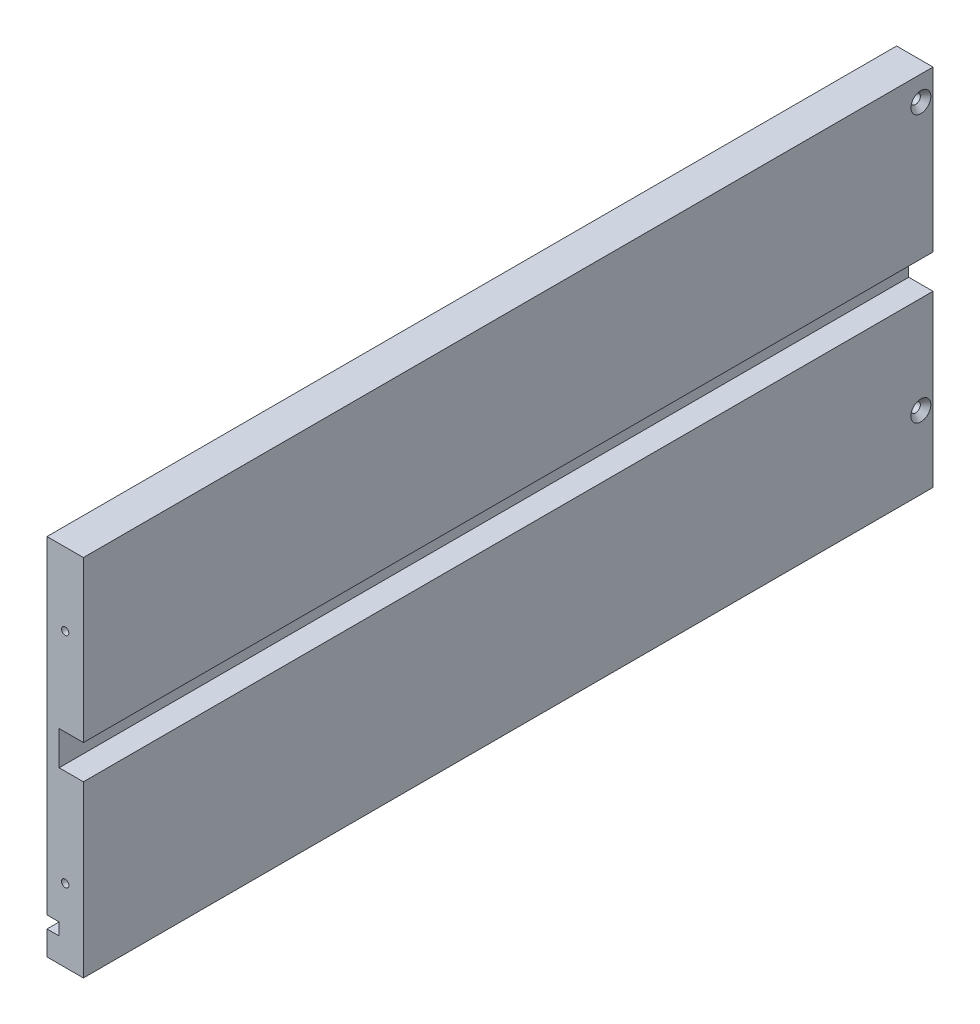
ISO-10303-21;
HEADER;
FILE_DESCRIPTION(('STEP AP214'),'2;1');
FILE_NAME('part.step','',(''),(''),'','','');
FILE_SCHEMA(('AUTOMOTIVE_DESIGN { 1 0 10303 214 1 1 1 1 }'));
ENDSEC;
DATA;
#1=APPLICATION_CONTEXT('core data for automotive mechanical design processes');
#2=APPLICATION_PROTOCOL_DEFINITION('international standard','automotive_design',2000,#1);
#3=PRODUCT_CONTEXT('',#1,'mechanical');
#4=PRODUCT('Part','Part','',(#3));
#5=PRODUCT_RELATED_PRODUCT_CATEGORY('part','',(#4));
#6=PRODUCT_DEFINITION_FORMATION('','',#4);
#7=PRODUCT_DEFINITION_CONTEXT('part definition',#1,'design');
#8=PRODUCT_DEFINITION('design','',#6,#7);
#9=PRODUCT_DEFINITION_SHAPE('','',#8);
#10=(LENGTH_UNIT() NAMED_UNIT(*) SI_UNIT(.MILLI.,.METRE.));
#11=(NAMED_UNIT(*) PLANE_ANGLE_UNIT() SI_UNIT($,.RADIAN.));
#12=(NAMED_UNIT(*) SI_UNIT($,.STERADIAN.) SOLID_ANGLE_UNIT());
#13=UNCERTAINTY_MEASURE_WITH_UNIT(LENGTH_MEASURE(1.E-05),#10,'distance_accuracy_value','');
#14=(GEOMETRIC_REPRESENTATION_CONTEXT(3) GLOBAL_UNCERTAINTY_ASSIGNED_CONTEXT((#13)) GLOBAL_UNIT_ASSIGNED_CONTEXT((#10,
#11,#12)) REPRESENTATION_CONTEXT('',''));
#15=CARTESIAN_POINT('',(0.,0.,0.));
#16=DIRECTION('',(0.,0.,1.));
#17=DIRECTION('',(1.,0.,0.));
#18=AXIS2_PLACEMENT_3D('',#15,#16,#17);
#19=CARTESIAN_POINT('',(-15.,150.,0.));
#20=DIRECTION('',(-1.,0.,0.));
#21=DIRECTION('',(0.,0.,1.));
#22=AXIS2_PLACEMENT_3D('',#19,#20,#21);
#23=PLANE('',#22);
#24=CARTESIAN_POINT('',(-15.,140.,-345.));
#25=DIRECTION('',(1.,0.,0.));
#26=DIRECTION('',(0.,0.,-1.));
#27=AXIS2_PLACEMENT_3D('',#24,#25,#26);
#28=CIRCLE('',#27,1.95000000000001);
#29=CARTESIAN_POINT('',(-15.,140.,-346.95));
#30=VERTEX_POINT('',#29);
#31=EDGE_CURVE('E146',#30,#30,#28,.T.);
#32=ORIENTED_EDGE('',*,*,#31,.T.);
#33=EDGE_LOOP('',(#32));
#34=FACE_BOUND('',#33,.T.);
#35=CARTESIAN_POINT('',(-15.,30.,-345.));
#36=DIRECTION('',(1.,0.,0.));
#37=DIRECTION('',(0.,0.,-1.));
#38=AXIS2_PLACEMENT_3D('',#35,#36,#37);
#39=CIRCLE('',#38,1.94999999999999);
#40=CARTESIAN_POINT('',(-15.,30.,-346.95));
#41=VERTEX_POINT('',#40);
#42=EDGE_CURVE('E155',#41,#41,#39,.T.);
#43=ORIENTED_EDGE('',*,*,#42,.T.);
#44=EDGE_LOOP('',(#43));
#45=FACE_BOUND('',#44,.T.);
#46=DIRECTION('',(0.,0.,1.));
#47=VECTOR('',#46,1.);
#48=CARTESIAN_POINT('',(-15.,15.,-350.));
#49=LINE('',#48,#47);
#50=CARTESIAN_POINT('',(-15.,15.,-350.));
#51=VERTEX_POINT('',#50);
#52=CARTESIAN_POINT('',(-15.,15.,0.));
#53=VERTEX_POINT('',#52);
#54=EDGE_CURVE('E180',#51,#53,#49,.T.);
#55=ORIENTED_EDGE('',*,*,#54,.T.);
#56=DIRECTION('',(0.,-1.,0.));
#57=VECTOR('',#56,1.);
#58=CARTESIAN_POINT('',(-15.,0.,0.));
#59=LINE('',#58,#57);
#60=CARTESIAN_POINT('',(-15.,150.,0.));
#61=VERTEX_POINT('',#60);
#62=EDGE_CURVE('E213',#61,#53,#59,.T.);
#63=ORIENTED_EDGE('',*,*,#62,.F.);
#64=DIRECTION('',(0.,0.,1.));
#65=VECTOR('',#64,1.);
#66=CARTESIAN_POINT('',(-15.,150.,0.));
#67=LINE('',#66,#65);
#68=CARTESIAN_POINT('',(-15.,150.,-350.));
#69=VERTEX_POINT('',#68);
#70=EDGE_CURVE('E224',#69,#61,#67,.T.);
#71=ORIENTED_EDGE('',*,*,#70,.F.);
#72=DIRECTION('',(0.,1.,0.));
#73=VECTOR('',#72,1.);
#74=CARTESIAN_POINT('',(-15.,0.,-350.));
#75=LINE('',#74,#73);
#76=EDGE_CURVE('E220',#51,#69,#75,.T.);
#77=ORIENTED_EDGE('',*,*,#76,.F.);
#78=EDGE_LOOP('',(#55,#63,#71,#77));
#79=FACE_BOUND('',#78,.T.);
#80=ADVANCED_FACE('F32',(#34,#45,#79),#23,.T.);
#81=CARTESIAN_POINT('',(0.,150.,0.));
#82=DIRECTION('',(-1.,0.,0.));
#83=DIRECTION('',(0.,0.,1.));
#84=AXIS2_PLACEMENT_3D('',#81,#82,#83);
#85=PLANE('',#84);
#86=CARTESIAN_POINT('',(0.,30.,-345.));
#87=DIRECTION('',(1.,0.,0.));
#88=DIRECTION('',(0.,0.,-1.));
#89=AXIS2_PLACEMENT_3D('',#86,#87,#88);
#90=CIRCLE('',#89,4.1);
#91=CARTESIAN_POINT('',(0.,30.,-349.1));
#92=VERTEX_POINT('',#91);
#93=EDGE_CURVE('E161',#92,#92,#90,.T.);
#94=ORIENTED_EDGE('',*,*,#93,.F.);
#95=EDGE_LOOP('',(#94));
#96=FACE_BOUND('',#95,.T.);
#97=DIRECTION('',(0.,1.,0.));
#98=VECTOR('',#97,1.);
#99=CARTESIAN_POINT('',(0.,0.,-350.));
#100=LINE('',#99,#98);
#101=CARTESIAN_POINT('',(0.,0.,-350.));
#102=VERTEX_POINT('',#101);
#103=CARTESIAN_POINT('',(0.,70.,-350.));
#104=VERTEX_POINT('',#103);
#105=EDGE_CURVE('E234',#102,#104,#100,.T.);
#106=ORIENTED_EDGE('',*,*,#105,.T.);
#107=DIRECTION('',(0.,0.,1.));
#108=VECTOR('',#107,1.);
#109=CARTESIAN_POINT('',(0.,70.,-350.));
#110=LINE('',#109,#108);
#111=CARTESIAN_POINT('',(0.,70.,0.));
#112=VERTEX_POINT('',#111);
#113=EDGE_CURVE('E204',#104,#112,#110,.T.);
#114=ORIENTED_EDGE('',*,*,#113,.T.);
#115=DIRECTION('',(0.,-1.,0.));
#116=VECTOR('',#115,1.);
#117=CARTESIAN_POINT('',(0.,0.,0.));
#118=LINE('',#117,#116);
#119=CARTESIAN_POINT('',(0.,0.,0.));
#120=VERTEX_POINT('',#119);
#121=EDGE_CURVE('E207',#112,#120,#118,.T.);
#122=ORIENTED_EDGE('',*,*,#121,.T.);
#123=DIRECTION('',(0.,0.,-1.));
#124=VECTOR('',#123,1.);
#125=CARTESIAN_POINT('',(0.,0.,0.));
#126=LINE('',#125,#124);
#127=EDGE_CURVE('E230',#120,#102,#126,.T.);
#128=ORIENTED_EDGE('',*,*,#127,.T.);
#129=EDGE_LOOP('',(#106,#114,#122,#128));
#130=FACE_BOUND('',#129,.T.);
#131=ADVANCED_FACE('F256',(#96,#130),#85,.F.);
#132=CARTESIAN_POINT('',(-15.,0.,0.));
#133=DIRECTION('',(0.,0.,1.));
#134=DIRECTION('',(1.,0.,0.));
#135=AXIS2_PLACEMENT_3D('',#132,#133,#134);
#136=PLANE('',#135);
#137=CARTESIAN_POINT('',(-7.5,30.,0.));
#138=DIRECTION('',(0.,0.,1.));
#139=DIRECTION('',(1.,0.,0.));
#140=AXIS2_PLACEMENT_3D('',#137,#138,#139);
#141=CIRCLE('',#140,1.5);
#142=CARTESIAN_POINT('',(-6.00000000000001,30.,0.));
#143=VERTEX_POINT('',#142);
#144=EDGE_CURVE('E135',#143,#143,#141,.T.);
#145=ORIENTED_EDGE('',*,*,#144,.F.);
#146=EDGE_LOOP('',(#145));
#147=FACE_BOUND('',#146,.T.);
#148=CARTESIAN_POINT('',(-7.50000000000001,120.,0.));
#149=DIRECTION('',(0.,0.,1.));
#150=DIRECTION('',(1.,0.,0.));
#151=AXIS2_PLACEMENT_3D('',#148,#149,#150);
#152=CIRCLE('',#151,1.5);
#153=CARTESIAN_POINT('',(-6.00000000000002,120.,0.));
#154=VERTEX_POINT('',#153);
#155=EDGE_CURVE('E143',#154,#154,#152,.T.);
#156=ORIENTED_EDGE('',*,*,#155,.F.);
#157=EDGE_LOOP('',(#156));
#158=FACE_BOUND('',#157,.T.);
#159=DIRECTION('',(-1.,0.,0.));
#160=VECTOR('',#159,1.);
#161=CARTESIAN_POINT('',(-15.,15.,0.));
#162=LINE('',#161,#160);
#163=CARTESIAN_POINT('',(-10.,15.,0.));
#164=VERTEX_POINT('',#163);
#165=EDGE_CURVE('E167',#164,#53,#162,.T.);
#166=ORIENTED_EDGE('',*,*,#165,.F.);
#167=DIRECTION('',(0.,1.,0.));
#168=VECTOR('',#167,1.);
#169=CARTESIAN_POINT('',(-10.,10.,0.));
#170=LINE('',#169,#168);
#171=CARTESIAN_POINT('',(-10.,10.,0.));
#172=VERTEX_POINT('',#171);
#173=EDGE_CURVE('E176',#172,#164,#170,.T.);
#174=ORIENTED_EDGE('',*,*,#173,.F.);
#175=DIRECTION('',(1.,0.,0.));
#176=VECTOR('',#175,1.);
#177=CARTESIAN_POINT('',(-15.,10.,0.));
#178=LINE('',#177,#176);
#179=CARTESIAN_POINT('',(-15.,10.,0.));
#180=VERTEX_POINT('',#179);
#181=EDGE_CURVE('E164',#180,#172,#178,.T.);
#182=ORIENTED_EDGE('',*,*,#181,.F.);
#183=CARTESIAN_POINT('',(-15.,0.,0.));
#184=VERTEX_POINT('',#183);
#185=EDGE_CURVE('E217',#180,#184,#59,.T.);
#186=ORIENTED_EDGE('',*,*,#185,.T.);
#187=DIRECTION('',(1.,0.,0.));
#188=VECTOR('',#187,1.);
#189=CARTESIAN_POINT('',(-15.,0.,0.));
#190=LINE('',#189,#188);
#191=EDGE_CURVE('E36',#184,#120,#190,.T.);
#192=ORIENTED_EDGE('',*,*,#191,.T.);
#193=ORIENTED_EDGE('',*,*,#121,.F.);
#194=DIRECTION('',(1.,0.,0.));
#195=VECTOR('',#194,1.);
#196=CARTESIAN_POINT('',(0.,70.,0.));
#197=LINE('',#196,#195);
#198=CARTESIAN_POINT('',(-10.,70.,0.));
#199=VERTEX_POINT('',#198);
#200=EDGE_CURVE('E191',#199,#112,#197,.T.);
#201=ORIENTED_EDGE('',*,*,#200,.F.);
#202=DIRECTION('',(0.,-1.,0.));
#203=VECTOR('',#202,1.);
#204=CARTESIAN_POINT('',(-10.,70.,0.));
#205=LINE('',#204,#203);
#206=CARTESIAN_POINT('',(-10.,84.,0.));
#207=VERTEX_POINT('',#206);
#208=EDGE_CURVE('E200',#207,#199,#205,.T.);
#209=ORIENTED_EDGE('',*,*,#208,.F.);
#210=DIRECTION('',(-1.,0.,0.));
#211=VECTOR('',#210,1.);
#212=CARTESIAN_POINT('',(0.,84.,0.));
#213=LINE('',#212,#211);
#214=CARTESIAN_POINT('',(0.,84.,0.));
#215=VERTEX_POINT('',#214);
#216=EDGE_CURVE('E183',#215,#207,#213,.T.);
#217=ORIENTED_EDGE('',*,*,#216,.F.);
#218=CARTESIAN_POINT('',(0.,150.,0.));
#219=VERTEX_POINT('',#218);
#220=EDGE_CURVE('E227',#219,#215,#118,.T.);
#221=ORIENTED_EDGE('',*,*,#220,.F.);
#222=DIRECTION('',(1.,0.,0.));
#223=VECTOR('',#222,1.);
#224=CARTESIAN_POINT('',(-15.,150.,0.));
#225=LINE('',#224,#223);
#226=EDGE_CURVE('E11',#61,#219,#225,.T.);
#227=ORIENTED_EDGE('',*,*,#226,.F.);
#228=ORIENTED_EDGE('',*,*,#62,.T.);
#229=EDGE_LOOP('',(#166,#174,#182,#186,#192,#193,#201,#209,#217,#221,#227,#228));
#230=FACE_BOUND('',#229,.T.);
#231=ADVANCED_FACE('F34',(#147,#158,#230),#136,.T.);
#232=CARTESIAN_POINT('',(-15.,150.,0.));
#233=DIRECTION('',(0.,1.,0.));
#234=DIRECTION('',(0.,0.,1.));
#235=AXIS2_PLACEMENT_3D('',#232,#233,#234);
#236=PLANE('',#235);
#237=DIRECTION('',(0.,0.,1.));
#238=VECTOR('',#237,1.);
#239=CARTESIAN_POINT('',(0.,150.,0.));
#240=LINE('',#239,#238);
#241=CARTESIAN_POINT('',(0.,150.,-350.));
#242=VERTEX_POINT('',#241);
#243=EDGE_CURVE('E237',#242,#219,#240,.T.);
#244=ORIENTED_EDGE('',*,*,#243,.F.);
#245=DIRECTION('',(1.,0.,0.));
#246=VECTOR('',#245,1.);
#247=CARTESIAN_POINT('',(-15.,150.,-350.));
#248=LINE('',#247,#246);
#249=EDGE_CURVE('E41',#69,#242,#248,.T.);
#250=ORIENTED_EDGE('',*,*,#249,.F.);
#251=ORIENTED_EDGE('',*,*,#70,.T.);
#252=ORIENTED_EDGE('',*,*,#226,.T.);
#253=EDGE_LOOP('',(#244,#250,#251,#252));
#254=FACE_BOUND('',#253,.T.);
#255=ADVANCED_FACE('F274',(#254),#236,.T.);
#256=CARTESIAN_POINT('',(-15.,0.,-350.));
#257=DIRECTION('',(0.,0.,-1.));
#258=DIRECTION('',(-1.,0.,0.));
#259=AXIS2_PLACEMENT_3D('',#256,#257,#258);
#260=PLANE('',#259);
#261=DIRECTION('',(-1.,0.,0.));
#262=VECTOR('',#261,1.);
#263=CARTESIAN_POINT('',(-15.,15.,-350.));
#264=LINE('',#263,#262);
#265=CARTESIAN_POINT('',(-10.,15.,-350.));
#266=VERTEX_POINT('',#265);
#267=EDGE_CURVE('E170',#266,#51,#264,.T.);
#268=ORIENTED_EDGE('',*,*,#267,.T.);
#269=ORIENTED_EDGE('',*,*,#76,.T.);
#270=ORIENTED_EDGE('',*,*,#249,.T.);
#271=CARTESIAN_POINT('',(0.,84.,-350.));
#272=VERTEX_POINT('',#271);
#273=EDGE_CURVE('E233',#272,#242,#100,.T.);
#274=ORIENTED_EDGE('',*,*,#273,.F.);
#275=DIRECTION('',(-1.,0.,0.));
#276=VECTOR('',#275,1.);
#277=CARTESIAN_POINT('',(0.,84.,-350.));
#278=LINE('',#277,#276);
#279=CARTESIAN_POINT('',(-10.,84.,-350.));
#280=VERTEX_POINT('',#279);
#281=EDGE_CURVE('E57',#272,#280,#278,.T.);
#282=ORIENTED_EDGE('',*,*,#281,.T.);
#283=DIRECTION('',(0.,-1.,0.));
#284=VECTOR('',#283,1.);
#285=CARTESIAN_POINT('',(-10.,70.,-350.));
#286=LINE('',#285,#284);
#287=CARTESIAN_POINT('',(-10.,70.,-350.));
#288=VERTEX_POINT('',#287);
#289=EDGE_CURVE('E190',#280,#288,#286,.T.);
#290=ORIENTED_EDGE('',*,*,#289,.T.);
#291=DIRECTION('',(1.,0.,0.));
#292=VECTOR('',#291,1.);
#293=CARTESIAN_POINT('',(0.,70.,-350.));
#294=LINE('',#293,#292);
#295=EDGE_CURVE('E194',#288,#104,#294,.T.);
#296=ORIENTED_EDGE('',*,*,#295,.T.);
#297=ORIENTED_EDGE('',*,*,#105,.F.);
#298=DIRECTION('',(1.,0.,0.));
#299=VECTOR('',#298,1.);
#300=CARTESIAN_POINT('',(-15.,0.,-350.));
#301=LINE('',#300,#299);
#302=CARTESIAN_POINT('',(-15.,0.,-350.));
#303=VERTEX_POINT('',#302);
#304=EDGE_CURVE('E241',#303,#102,#301,.T.);
#305=ORIENTED_EDGE('',*,*,#304,.F.);
#306=CARTESIAN_POINT('',(-15.,10.,-350.));
#307=VERTEX_POINT('',#306);
#308=EDGE_CURVE('E221',#303,#307,#75,.T.);
#309=ORIENTED_EDGE('',*,*,#308,.T.);
#310=DIRECTION('',(1.,0.,0.));
#311=VECTOR('',#310,1.);
#312=CARTESIAN_POINT('',(-15.,10.,-350.));
#313=LINE('',#312,#311);
#314=CARTESIAN_POINT('',(-10.,10.,-350.));
#315=VERTEX_POINT('',#314);
#316=EDGE_CURVE('E49',#307,#315,#313,.T.);
#317=ORIENTED_EDGE('',*,*,#316,.T.);
#318=DIRECTION('',(0.,1.,0.));
#319=VECTOR('',#318,1.);
#320=CARTESIAN_POINT('',(-10.,10.,-350.));
#321=LINE('',#320,#319);
#322=EDGE_CURVE('E166',#315,#266,#321,.T.);
#323=ORIENTED_EDGE('',*,*,#322,.T.);
#324=EDGE_LOOP('',(#268,#269,#270,#274,#282,#290,#296,#297,#305,#309,#317,#323));
#325=FACE_BOUND('',#324,.T.);
#326=ADVANCED_FACE('F261',(#325),#260,.T.);
#327=CARTESIAN_POINT('',(-15.,0.,0.));
#328=DIRECTION('',(0.,-1.,0.));
#329=DIRECTION('',(0.,0.,-1.));
#330=AXIS2_PLACEMENT_3D('',#327,#328,#329);
#331=PLANE('',#330);
#332=ORIENTED_EDGE('',*,*,#127,.F.);
#333=ORIENTED_EDGE('',*,*,#191,.F.);
#334=DIRECTION('',(0.,0.,-1.));
#335=VECTOR('',#334,1.);
#336=CARTESIAN_POINT('',(-15.,0.,0.));
#337=LINE('',#336,#335);
#338=EDGE_CURVE('E216',#184,#303,#337,.T.);
#339=ORIENTED_EDGE('',*,*,#338,.T.);
#340=ORIENTED_EDGE('',*,*,#304,.T.);
#341=EDGE_LOOP('',(#332,#333,#339,#340));
#342=FACE_BOUND('',#341,.T.);
#343=ADVANCED_FACE('F254',(#342),#331,.T.);
#344=DIRECTION('',(0.,0.,1.));
#345=VECTOR('',#344,1.);
#346=CARTESIAN_POINT('',(-15.,10.,-350.));
#347=LINE('',#346,#345);
#348=EDGE_CURVE('E173',#307,#180,#347,.T.);
#349=ORIENTED_EDGE('',*,*,#348,.F.);
#350=ORIENTED_EDGE('',*,*,#308,.F.);
#351=ORIENTED_EDGE('',*,*,#338,.F.);
#352=ORIENTED_EDGE('',*,*,#185,.F.);
#353=EDGE_LOOP('',(#349,#350,#351,#352));
#354=FACE_BOUND('',#353,.T.);
#355=ADVANCED_FACE('F287',(#354),#23,.T.);
#356=CARTESIAN_POINT('',(0.,140.,-345.));
#357=DIRECTION('',(1.,0.,0.));
#358=DIRECTION('',(0.,0.,-1.));
#359=AXIS2_PLACEMENT_3D('',#356,#357,#358);
#360=CIRCLE('',#359,4.09999999999999);
#361=CARTESIAN_POINT('',(0.,140.,-349.1));
#362=VERTEX_POINT('',#361);
#363=EDGE_CURVE('E152',#362,#362,#360,.T.);
#364=ORIENTED_EDGE('',*,*,#363,.F.);
#365=EDGE_LOOP('',(#364));
#366=FACE_BOUND('',#365,.T.);
#367=ORIENTED_EDGE('',*,*,#220,.T.);
#368=DIRECTION('',(0.,0.,1.));
#369=VECTOR('',#368,1.);
#370=CARTESIAN_POINT('',(0.,84.,-350.));
#371=LINE('',#370,#369);
#372=EDGE_CURVE('E197',#272,#215,#371,.T.);
#373=ORIENTED_EDGE('',*,*,#372,.F.);
#374=ORIENTED_EDGE('',*,*,#273,.T.);
#375=ORIENTED_EDGE('',*,*,#243,.T.);
#376=EDGE_LOOP('',(#367,#373,#374,#375));
#377=FACE_BOUND('',#376,.T.);
#378=ADVANCED_FACE('F270',(#366,#377),#85,.F.);
#379=CARTESIAN_POINT('',(0.,70.,-350.));
#380=DIRECTION('',(0.,-1.,0.));
#381=DIRECTION('',(0.,0.,-1.));
#382=AXIS2_PLACEMENT_3D('',#379,#380,#381);
#383=PLANE('',#382);
#384=ORIENTED_EDGE('',*,*,#200,.T.);
#385=ORIENTED_EDGE('',*,*,#113,.F.);
#386=ORIENTED_EDGE('',*,*,#295,.F.);
#387=DIRECTION('',(0.,0.,1.));
#388=VECTOR('',#387,1.);
#389=CARTESIAN_POINT('',(-10.,70.,-350.));
#390=LINE('',#389,#388);
#391=EDGE_CURVE('E208',#288,#199,#390,.T.);
#392=ORIENTED_EDGE('',*,*,#391,.T.);
#393=EDGE_LOOP('',(#384,#385,#386,#392));
#394=FACE_BOUND('',#393,.T.);
#395=ADVANCED_FACE('F259',(#394),#383,.F.);
#396=CARTESIAN_POINT('',(-10.,70.,-350.));
#397=DIRECTION('',(-1.,0.,0.));
#398=DIRECTION('',(0.,0.,1.));
#399=AXIS2_PLACEMENT_3D('',#396,#397,#398);
#400=PLANE('',#399);
#401=ORIENTED_EDGE('',*,*,#208,.T.);
#402=ORIENTED_EDGE('',*,*,#391,.F.);
#403=ORIENTED_EDGE('',*,*,#289,.F.);
#404=DIRECTION('',(0.,0.,1.));
#405=VECTOR('',#404,1.);
#406=CARTESIAN_POINT('',(-10.,84.,-350.));
#407=LINE('',#406,#405);
#408=EDGE_CURVE('E210',#280,#207,#407,.T.);
#409=ORIENTED_EDGE('',*,*,#408,.T.);
#410=EDGE_LOOP('',(#401,#402,#403,#409));
#411=FACE_BOUND('',#410,.T.);
#412=ADVANCED_FACE('F265',(#411),#400,.F.);
#413=CARTESIAN_POINT('',(0.,84.,-350.));
#414=DIRECTION('',(0.,1.,0.));
#415=DIRECTION('',(0.,0.,1.));
#416=AXIS2_PLACEMENT_3D('',#413,#414,#415);
#417=PLANE('',#416);
#418=ORIENTED_EDGE('',*,*,#216,.T.);
#419=ORIENTED_EDGE('',*,*,#408,.F.);
#420=ORIENTED_EDGE('',*,*,#281,.F.);
#421=ORIENTED_EDGE('',*,*,#372,.T.);
#422=EDGE_LOOP('',(#418,#419,#420,#421));
#423=FACE_BOUND('',#422,.T.);
#424=ADVANCED_FACE('F359',(#423),#417,.F.);
#425=CARTESIAN_POINT('',(-15.,15.,-350.));
#426=DIRECTION('',(0.,1.,0.));
#427=DIRECTION('',(0.,0.,1.));
#428=AXIS2_PLACEMENT_3D('',#425,#426,#427);
#429=PLANE('',#428);
#430=ORIENTED_EDGE('',*,*,#165,.T.);
#431=ORIENTED_EDGE('',*,*,#54,.F.);
#432=ORIENTED_EDGE('',*,*,#267,.F.);
#433=DIRECTION('',(0.,0.,1.));
#434=VECTOR('',#433,1.);
#435=CARTESIAN_POINT('',(-10.,15.,-350.));
#436=LINE('',#435,#434);
#437=EDGE_CURVE('E184',#266,#164,#436,.T.);
#438=ORIENTED_EDGE('',*,*,#437,.T.);
#439=EDGE_LOOP('',(#430,#431,#432,#438));
#440=FACE_BOUND('',#439,.T.);
#441=ADVANCED_FACE('F281',(#440),#429,.F.);
#442=CARTESIAN_POINT('',(-10.,10.,-350.));
#443=DIRECTION('',(1.,0.,0.));
#444=DIRECTION('',(0.,0.,-1.));
#445=AXIS2_PLACEMENT_3D('',#442,#443,#444);
#446=PLANE('',#445);
#447=ORIENTED_EDGE('',*,*,#173,.T.);
#448=ORIENTED_EDGE('',*,*,#437,.F.);
#449=ORIENTED_EDGE('',*,*,#322,.F.);
#450=DIRECTION('',(0.,0.,1.));
#451=VECTOR('',#450,1.);
#452=CARTESIAN_POINT('',(-10.,10.,-350.));
#453=LINE('',#452,#451);
#454=EDGE_CURVE('E186',#315,#172,#453,.T.);
#455=ORIENTED_EDGE('',*,*,#454,.T.);
#456=EDGE_LOOP('',(#447,#448,#449,#455));
#457=FACE_BOUND('',#456,.T.);
#458=ADVANCED_FACE('F284',(#457),#446,.F.);
#459=CARTESIAN_POINT('',(-15.,10.,-350.));
#460=DIRECTION('',(0.,-1.,0.));
#461=DIRECTION('',(1.,0.,0.));
#462=AXIS2_PLACEMENT_3D('',#459,#460,#461);
#463=PLANE('',#462);
#464=ORIENTED_EDGE('',*,*,#181,.T.);
#465=ORIENTED_EDGE('',*,*,#454,.F.);
#466=ORIENTED_EDGE('',*,*,#316,.F.);
#467=ORIENTED_EDGE('',*,*,#348,.T.);
#468=EDGE_LOOP('',(#464,#465,#466,#467));
#469=FACE_BOUND('',#468,.T.);
#470=ADVANCED_FACE('F289',(#469),#463,.F.);
#471=CARTESIAN_POINT('',(0.,30.,-345.));
#472=DIRECTION('',(1.,0.,0.));
#473=DIRECTION('',(0.,0.,-1.));
#474=AXIS2_PLACEMENT_3D('',#471,#472,#473);
#475=CONICAL_SURFACE('',#474,4.1,0.785398163397448);
#476=CARTESIAN_POINT('',(-2.15,30.,-345.));
#477=DIRECTION('',(1.,0.,0.));
#478=DIRECTION('',(0.,0.,-1.));
#479=AXIS2_PLACEMENT_3D('',#476,#477,#478);
#480=CIRCLE('',#479,1.95);
#481=CARTESIAN_POINT('',(-2.15,30.,-346.95));
#482=VERTEX_POINT('',#481);
#483=EDGE_CURVE('E158',#482,#482,#480,.T.);
#484=ORIENTED_EDGE('',*,*,#483,.F.);
#485=EDGE_LOOP('',(#484));
#486=FACE_BOUND('',#485,.T.);
#487=ORIENTED_EDGE('',*,*,#93,.T.);
#488=EDGE_LOOP('',(#487));
#489=FACE_BOUND('',#488,.T.);
#490=ADVANCED_FACE('F291',(#486,#489),#475,.F.);
#491=CARTESIAN_POINT('',(0.,30.,-345.));
#492=DIRECTION('',(1.,0.,0.));
#493=DIRECTION('',(0.,0.,-1.));
#494=AXIS2_PLACEMENT_3D('',#491,#492,#493);
#495=CYLINDRICAL_SURFACE('',#494,1.95);
#496=ORIENTED_EDGE('',*,*,#42,.F.);
#497=EDGE_LOOP('',(#496));
#498=FACE_BOUND('',#497,.T.);
#499=ORIENTED_EDGE('',*,*,#483,.T.);
#500=EDGE_LOOP('',(#499));
#501=FACE_BOUND('',#500,.T.);
#502=ADVANCED_FACE('F297',(#498,#501),#495,.F.);
#503=CARTESIAN_POINT('',(0.,140.,-345.));
#504=DIRECTION('',(1.,0.,0.));
#505=DIRECTION('',(0.,0.,-1.));
#506=AXIS2_PLACEMENT_3D('',#503,#504,#505);
#507=CONICAL_SURFACE('',#506,4.09999999999999,0.785398163397445);
#508=CARTESIAN_POINT('',(-2.15,140.,-345.));
#509=DIRECTION('',(1.,0.,0.));
#510=DIRECTION('',(0.,0.,-1.));
#511=AXIS2_PLACEMENT_3D('',#508,#509,#510);
#512=CIRCLE('',#511,1.95000000000001);
#513=CARTESIAN_POINT('',(-2.15,140.,-346.95));
#514=VERTEX_POINT('',#513);
#515=EDGE_CURVE('E149',#514,#514,#512,.T.);
#516=ORIENTED_EDGE('',*,*,#515,.F.);
#517=EDGE_LOOP('',(#516));
#518=FACE_BOUND('',#517,.T.);
#519=ORIENTED_EDGE('',*,*,#363,.T.);
#520=EDGE_LOOP('',(#519));
#521=FACE_BOUND('',#520,.T.);
#522=ADVANCED_FACE('F346',(#518,#521),#507,.F.);
#523=CARTESIAN_POINT('',(0.,140.,-345.));
#524=DIRECTION('',(1.,0.,0.));
#525=DIRECTION('',(0.,0.,-1.));
#526=AXIS2_PLACEMENT_3D('',#523,#524,#525);
#527=CYLINDRICAL_SURFACE('',#526,1.95000000000001);
#528=ORIENTED_EDGE('',*,*,#31,.F.);
#529=EDGE_LOOP('',(#528));
#530=FACE_BOUND('',#529,.T.);
#531=ORIENTED_EDGE('',*,*,#515,.T.);
#532=EDGE_LOOP('',(#531));
#533=FACE_BOUND('',#532,.T.);
#534=ADVANCED_FACE('F337',(#530,#533),#527,.F.);
#535=CARTESIAN_POINT('',(-7.50000000000001,120.,0.));
#536=DIRECTION('',(0.,0.,1.));
#537=DIRECTION('',(1.,0.,0.));
#538=AXIS2_PLACEMENT_3D('',#535,#536,#537);
#539=CYLINDRICAL_SURFACE('',#538,1.5);
#540=CARTESIAN_POINT('',(-7.50000000000001,120.,-10.));
#541=DIRECTION('',(0.,0.,1.));
#542=DIRECTION('',(1.,0.,0.));
#543=AXIS2_PLACEMENT_3D('',#540,#541,#542);
#544=CIRCLE('',#543,1.5);
#545=CARTESIAN_POINT('',(-6.00000000000002,120.,-10.));
#546=VERTEX_POINT('',#545);
#547=EDGE_CURVE('E138',#546,#546,#544,.T.);
#548=ORIENTED_EDGE('',*,*,#547,.F.);
#549=EDGE_LOOP('',(#548));
#550=FACE_BOUND('',#549,.T.);
#551=ORIENTED_EDGE('',*,*,#155,.T.);
#552=EDGE_LOOP('',(#551));
#553=FACE_BOUND('',#552,.T.);
#554=ADVANCED_FACE('F334',(#550,#553),#539,.F.);
#555=CARTESIAN_POINT('',(-7.50000000000001,120.,-10.));
#556=DIRECTION('',(0.,0.,1.));
#557=DIRECTION('',(1.,0.,0.));
#558=AXIS2_PLACEMENT_3D('',#555,#556,#557);
#559=CONICAL_SURFACE('',#558,1.5,1.02974425867665);
#560=CARTESIAN_POINT('',(-7.50000000000002,120.,-10.9012909285413));
#561=VERTEX_POINT('',#560);
#562=VERTEX_LOOP('',#561);
#563=FACE_BOUND('',#562,.T.);
#564=ORIENTED_EDGE('',*,*,#547,.T.);
#565=EDGE_LOOP('',(#564));
#566=FACE_BOUND('',#565,.T.);
#567=ADVANCED_FACE('F336',(#563,#566),#559,.F.);
#568=CARTESIAN_POINT('',(-7.5,30.,0.));
#569=DIRECTION('',(0.,0.,1.));
#570=DIRECTION('',(1.,0.,0.));
#571=AXIS2_PLACEMENT_3D('',#568,#569,#570);
#572=CYLINDRICAL_SURFACE('',#571,1.5);
#573=CARTESIAN_POINT('',(-7.5,30.,-10.));
#574=DIRECTION('',(0.,0.,1.));
#575=DIRECTION('',(1.,0.,0.));
#576=AXIS2_PLACEMENT_3D('',#573,#574,#575);
#577=CIRCLE('',#576,1.5);
#578=CARTESIAN_POINT('',(-6.00000000000001,30.,-10.));
#579=VERTEX_POINT('',#578);
#580=EDGE_CURVE('E133',#579,#579,#577,.T.);
#581=ORIENTED_EDGE('',*,*,#580,.F.);
#582=EDGE_LOOP('',(#581));
#583=FACE_BOUND('',#582,.T.);
#584=ORIENTED_EDGE('',*,*,#144,.T.);
#585=EDGE_LOOP('',(#584));
#586=FACE_BOUND('',#585,.T.);
#587=ADVANCED_FACE('F129',(#583,#586),#572,.F.);
#588=CARTESIAN_POINT('',(-7.5,30.,-10.));
#589=DIRECTION('',(0.,0.,1.));
#590=DIRECTION('',(1.,0.,0.));
#591=AXIS2_PLACEMENT_3D('',#588,#589,#590);
#592=CONICAL_SURFACE('',#591,1.5,1.02974425867665);
#593=CARTESIAN_POINT('',(-7.50000000000001,30.,-10.9012909285413));
#594=VERTEX_POINT('',#593);
#595=VERTEX_LOOP('',#594);
#596=FACE_BOUND('',#595,.T.);
#597=ORIENTED_EDGE('',*,*,#580,.T.);
#598=EDGE_LOOP('',(#597));
#599=FACE_BOUND('',#598,.T.);
#600=ADVANCED_FACE('F126',(#596,#599),#592,.F.);
#601=CLOSED_SHELL('',(#80,#131,#231,#255,#326,#343,#355,#378,#395,#412,#424,#441,#458,#470,#490,
#502,#522,#534,#554,#567,#587,#600));
#602=MANIFOLD_SOLID_BREP('B2',#601);
#603=ADVANCED_BREP_SHAPE_REPRESENTATION('',(#18,#602),#14);
#604=SHAPE_DEFINITION_REPRESENTATION(#9,#603);
ENDSEC;
END-ISO-10303-21;
